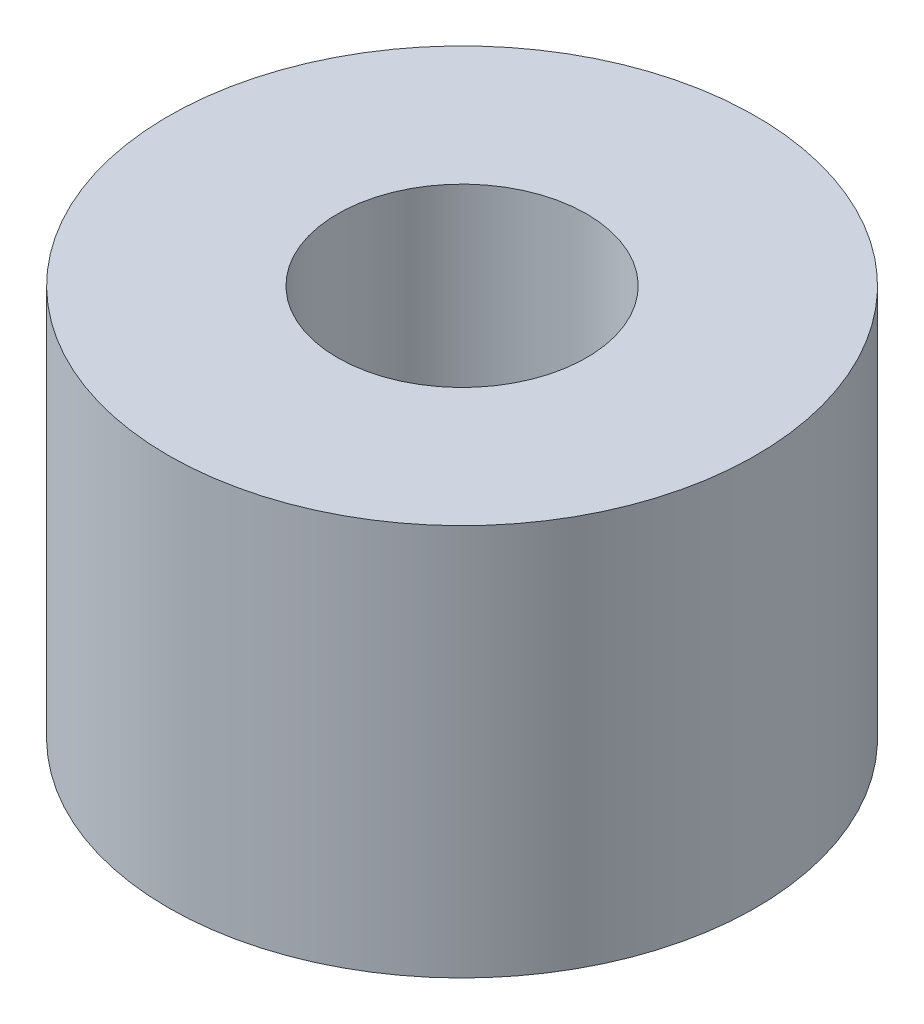
ISO-10303-21;
HEADER;
FILE_DESCRIPTION(('STEP AP214'),'2;1');
FILE_NAME('part.step','',(''),(''),'','','');
FILE_SCHEMA(('AUTOMOTIVE_DESIGN { 1 0 10303 214 1 1 1 1 }'));
ENDSEC;
DATA;
#1=APPLICATION_CONTEXT('core data for automotive mechanical design processes');
#2=APPLICATION_PROTOCOL_DEFINITION('international standard','automotive_design',2000,#1);
#3=PRODUCT_CONTEXT('',#1,'mechanical');
#4=PRODUCT('Part','Part','',(#3));
#5=PRODUCT_RELATED_PRODUCT_CATEGORY('part','',(#4));
#6=PRODUCT_DEFINITION_FORMATION('','',#4);
#7=PRODUCT_DEFINITION_CONTEXT('part definition',#1,'design');
#8=PRODUCT_DEFINITION('design','',#6,#7);
#9=PRODUCT_DEFINITION_SHAPE('','',#8);
#10=(LENGTH_UNIT() NAMED_UNIT(*) SI_UNIT(.MILLI.,.METRE.));
#11=(NAMED_UNIT(*) PLANE_ANGLE_UNIT() SI_UNIT($,.RADIAN.));
#12=(NAMED_UNIT(*) SI_UNIT($,.STERADIAN.) SOLID_ANGLE_UNIT());
#13=UNCERTAINTY_MEASURE_WITH_UNIT(LENGTH_MEASURE(1.E-05),#10,'distance_accuracy_value','');
#14=(GEOMETRIC_REPRESENTATION_CONTEXT(3) GLOBAL_UNCERTAINTY_ASSIGNED_CONTEXT((#13)) GLOBAL_UNIT_ASSIGNED_CONTEXT((#10,
#11,#12)) REPRESENTATION_CONTEXT('',''));
#15=CARTESIAN_POINT('',(0.,0.,0.));
#16=DIRECTION('',(0.,0.,1.));
#17=DIRECTION('',(1.,0.,0.));
#18=AXIS2_PLACEMENT_3D('',#15,#16,#17);
#19=CARTESIAN_POINT('',(0.,6.35,0.));
#20=DIRECTION('',(0.,1.,0.));
#21=DIRECTION('',(0.,0.,1.));
#22=AXIS2_PLACEMENT_3D('',#19,#20,#21);
#23=PLANE('',#22);
#24=CARTESIAN_POINT('',(0.,6.35,0.));
#25=DIRECTION('',(0.,1.,0.));
#26=DIRECTION('',(0.,0.,1.));
#27=AXIS2_PLACEMENT_3D('',#24,#25,#26);
#28=CIRCLE('',#27,2.01929999999999);
#29=CARTESIAN_POINT('',(0.,6.35,2.01929999999999));
#30=VERTEX_POINT('',#29);
#31=EDGE_CURVE('E50',#30,#30,#28,.T.);
#32=ORIENTED_EDGE('',*,*,#31,.F.);
#33=EDGE_LOOP('',(#32));
#34=FACE_BOUND('',#33,.T.);
#35=CARTESIAN_POINT('',(0.,6.35,0.));
#36=DIRECTION('',(0.,1.,0.));
#37=DIRECTION('',(0.,0.,1.));
#38=AXIS2_PLACEMENT_3D('',#35,#36,#37);
#39=CIRCLE('',#38,4.7625);
#40=CARTESIAN_POINT('',(0.,6.35,4.7625));
#41=VERTEX_POINT('',#40);
#42=EDGE_CURVE('E10',#41,#41,#39,.T.);
#43=ORIENTED_EDGE('',*,*,#42,.T.);
#44=EDGE_LOOP('',(#43));
#45=FACE_BOUND('',#44,.T.);
#46=ADVANCED_FACE('F35',(#34,#45),#23,.T.);
#47=CARTESIAN_POINT('',(0.,0.,0.));
#48=DIRECTION('',(0.,1.,0.));
#49=DIRECTION('',(0.,0.,1.));
#50=AXIS2_PLACEMENT_3D('',#47,#48,#49);
#51=PLANE('',#50);
#52=CARTESIAN_POINT('',(0.,0.,0.));
#53=DIRECTION('',(0.,1.,0.));
#54=DIRECTION('',(0.,0.,1.));
#55=AXIS2_PLACEMENT_3D('',#52,#53,#54);
#56=CIRCLE('',#55,2.0193);
#57=CARTESIAN_POINT('',(0.,0.,2.0193));
#58=VERTEX_POINT('',#57);
#59=EDGE_CURVE('E46',#58,#58,#56,.T.);
#60=ORIENTED_EDGE('',*,*,#59,.T.);
#61=EDGE_LOOP('',(#60));
#62=FACE_BOUND('',#61,.T.);
#63=CARTESIAN_POINT('',(0.,0.,0.));
#64=DIRECTION('',(0.,1.,0.));
#65=DIRECTION('',(0.,0.,1.));
#66=AXIS2_PLACEMENT_3D('',#63,#64,#65);
#67=CIRCLE('',#66,4.7625);
#68=CARTESIAN_POINT('',(0.,0.,4.7625));
#69=VERTEX_POINT('',#68);
#70=EDGE_CURVE('E39',#69,#69,#67,.T.);
#71=ORIENTED_EDGE('',*,*,#70,.F.);
#72=EDGE_LOOP('',(#71));
#73=FACE_BOUND('',#72,.T.);
#74=ADVANCED_FACE('F57',(#62,#73),#51,.F.);
#75=CARTESIAN_POINT('',(0.,6.35,0.));
#76=DIRECTION('',(0.,-1.,0.));
#77=DIRECTION('',(0.,0.,-1.));
#78=AXIS2_PLACEMENT_3D('',#75,#76,#77);
#79=CYLINDRICAL_SURFACE('',#78,4.7625);
#80=ORIENTED_EDGE('',*,*,#42,.F.);
#81=EDGE_LOOP('',(#80));
#82=FACE_BOUND('',#81,.T.);
#83=ORIENTED_EDGE('',*,*,#70,.T.);
#84=EDGE_LOOP('',(#83));
#85=FACE_BOUND('',#84,.T.);
#86=ADVANCED_FACE('F37',(#82,#85),#79,.T.);
#87=CARTESIAN_POINT('',(0.,6.35,0.));
#88=DIRECTION('',(0.,1.,0.));
#89=DIRECTION('',(0.,0.,1.));
#90=AXIS2_PLACEMENT_3D('',#87,#88,#89);
#91=CYLINDRICAL_SURFACE('',#90,2.01929999999999);
#92=ORIENTED_EDGE('',*,*,#59,.F.);
#93=EDGE_LOOP('',(#92));
#94=FACE_BOUND('',#93,.T.);
#95=ORIENTED_EDGE('',*,*,#31,.T.);
#96=EDGE_LOOP('',(#95));
#97=FACE_BOUND('',#96,.T.);
#98=ADVANCED_FACE('F54',(#94,#97),#91,.F.);
#99=CLOSED_SHELL('',(#46,#74,#86,#98));
#100=MANIFOLD_SOLID_BREP('B2',#99);
#101=ADVANCED_BREP_SHAPE_REPRESENTATION('',(#18,#100),#14);
#102=SHAPE_DEFINITION_REPRESENTATION(#9,#101);
ENDSEC;
END-ISO-10303-21;
